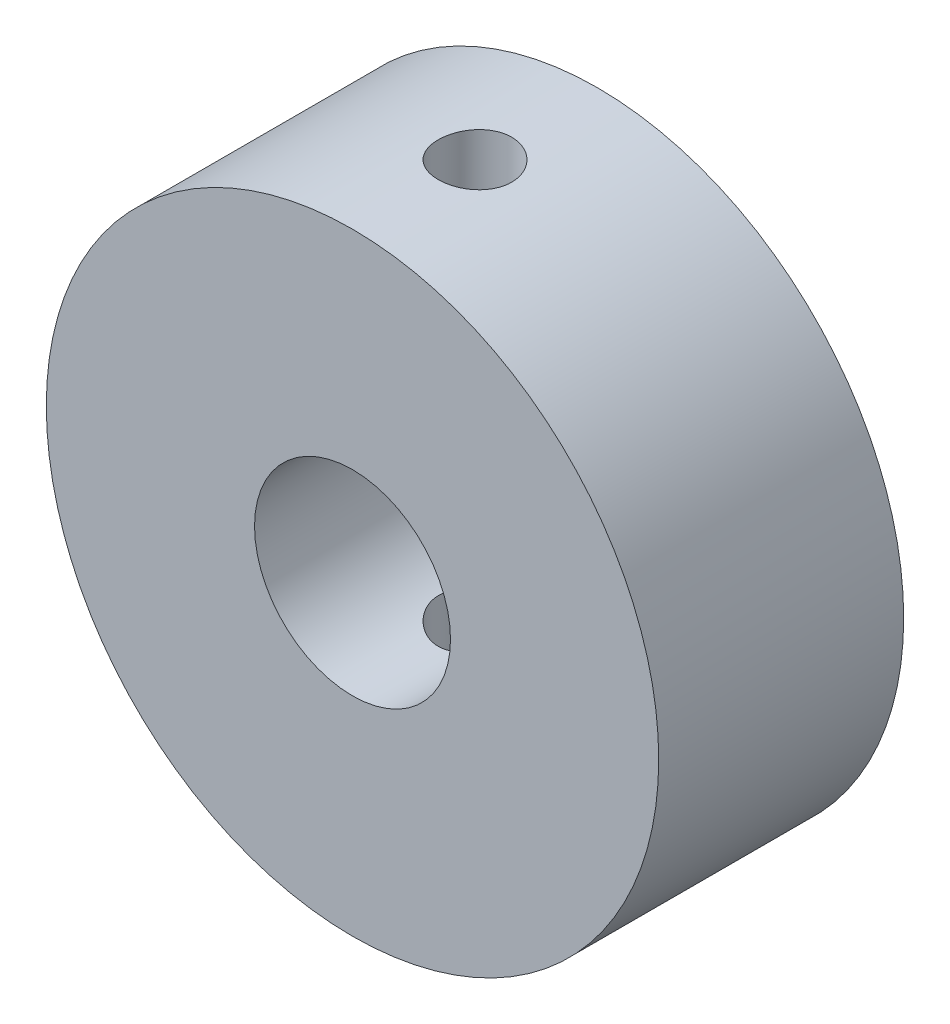
ISO-10303-21;
HEADER;
FILE_DESCRIPTION(('STEP AP214'),'2;1');
FILE_NAME('part.step','',(''),(''),'','','');
FILE_SCHEMA(('AUTOMOTIVE_DESIGN { 1 0 10303 214 1 1 1 1 }'));
ENDSEC;
DATA;
#1=APPLICATION_CONTEXT('core data for automotive mechanical design processes');
#2=APPLICATION_PROTOCOL_DEFINITION('international standard','automotive_design',2000,#1);
#3=PRODUCT_CONTEXT('',#1,'mechanical');
#4=PRODUCT('Part','Part','',(#3));
#5=PRODUCT_RELATED_PRODUCT_CATEGORY('part','',(#4));
#6=PRODUCT_DEFINITION_FORMATION('','',#4);
#7=PRODUCT_DEFINITION_CONTEXT('part definition',#1,'design');
#8=PRODUCT_DEFINITION('design','',#6,#7);
#9=PRODUCT_DEFINITION_SHAPE('','',#8);
#10=(LENGTH_UNIT() NAMED_UNIT(*) SI_UNIT(.MILLI.,.METRE.));
#11=(NAMED_UNIT(*) PLANE_ANGLE_UNIT() SI_UNIT($,.RADIAN.));
#12=(NAMED_UNIT(*) SI_UNIT($,.STERADIAN.) SOLID_ANGLE_UNIT());
#13=UNCERTAINTY_MEASURE_WITH_UNIT(LENGTH_MEASURE(1.E-05),#10,'distance_accuracy_value','');
#14=(GEOMETRIC_REPRESENTATION_CONTEXT(3) GLOBAL_UNCERTAINTY_ASSIGNED_CONTEXT((#13)) GLOBAL_UNIT_ASSIGNED_CONTEXT((#10,
#11,#12)) REPRESENTATION_CONTEXT('',''));
#15=CARTESIAN_POINT('',(0.,0.,0.));
#16=DIRECTION('',(0.,0.,1.));
#17=DIRECTION('',(1.,0.,0.));
#18=AXIS2_PLACEMENT_3D('',#15,#16,#17);
#19=CARTESIAN_POINT('',(0.,0.,5.));
#20=DIRECTION('',(0.,0.,-1.));
#21=DIRECTION('',(-1.,0.,0.));
#22=AXIS2_PLACEMENT_3D('',#19,#20,#21);
#23=CYLINDRICAL_SURFACE('',#22,12.5);
#24=CARTESIAN_POINT('',(0.,0.,5.));
#25=DIRECTION('',(0.,0.,1.));
#26=DIRECTION('',(1.,0.,0.));
#27=AXIS2_PLACEMENT_3D('',#24,#25,#26);
#28=CIRCLE('',#27,12.5);
#29=CARTESIAN_POINT('',(12.5,0.,5.));
#30=VERTEX_POINT('',#29);
#31=EDGE_CURVE('E10',#30,#30,#28,.T.);
#32=ORIENTED_EDGE('',*,*,#31,.F.);
#33=EDGE_LOOP('',(#32));
#34=FACE_BOUND('',#33,.T.);
#35=CARTESIAN_POINT('',(0.,0.,-5.));
#36=DIRECTION('',(0.,0.,1.));
#37=DIRECTION('',(1.,0.,0.));
#38=AXIS2_PLACEMENT_3D('',#35,#36,#37);
#39=CIRCLE('',#38,12.5);
#40=CARTESIAN_POINT('',(12.5,0.,-5.));
#41=VERTEX_POINT('',#40);
#42=EDGE_CURVE('E44',#41,#41,#39,.T.);
#43=ORIENTED_EDGE('',*,*,#42,.T.);
#44=EDGE_LOOP('',(#43));
#45=FACE_BOUND('',#44,.T.);
#46=CARTESIAN_POINT('',(0.,-12.5,-1.5));
#47=CARTESIAN_POINT('',(0.0839320235538497,-12.499998867873,-1.49999641802928));
#48=CARTESIAN_POINT('',(0.167917158665595,-12.4991457100204,-1.49293167065366));
#49=CARTESIAN_POINT('',(0.333552285654125,-12.495824352711,-1.46485946792231));
#50=CARTESIAN_POINT('',(0.415199714795034,-12.4933544466864,-1.44383727937471));
#51=CARTESIAN_POINT('',(0.573737397670264,-12.4870779632713,-1.38847686173699));
#52=CARTESIAN_POINT('',(0.650630743796124,-12.4832722657654,-1.35414739658791));
#53=CARTESIAN_POINT('',(0.797549578916,-12.4747479632173,-1.27316563245835));
#54=CARTESIAN_POINT('',(0.867576283567579,-12.4700295202071,-1.22651552012334));
#55=CARTESIAN_POINT('',(0.999145657672256,-12.460180052721,-1.12196256901238));
#56=CARTESIAN_POINT('',(1.0606483456536,-12.4550472515452,-1.06400957994404));
#57=CARTESIAN_POINT('',(1.17307965519171,-12.4449619698576,-0.938603517556051));
#58=CARTESIAN_POINT('',(1.22400774913237,-12.4400094983534,-0.871149970490676));
#59=CARTESIAN_POINT('',(1.31399171436948,-12.4308280185202,-0.728399587350809));
#60=CARTESIAN_POINT('',(1.35301037836285,-12.4266012951985,-0.653079137709931));
#61=CARTESIAN_POINT('',(1.4178302865078,-12.4193730672343,-0.496895648945627));
#62=CARTESIAN_POINT('',(1.44363199348388,-12.4163715196899,-0.416032804015349));
#63=CARTESIAN_POINT('',(1.481164650227,-12.4119503036869,-0.251473570344289));
#64=CARTESIAN_POINT('',(1.49296288993823,-12.4105230726271,-0.167792735786162));
#65=CARTESIAN_POINT('',(1.50236187609835,-12.4093888845306,0.000372468182082217));
#66=CARTESIAN_POINT('',(1.49996315026424,-12.4096818635516,0.0848568076084829));
#67=CARTESIAN_POINT('',(1.48109158039334,-12.4119480733153,0.251762982392175));
#68=CARTESIAN_POINT('',(1.46469271611151,-12.4139124717338,0.334193319340089));
#69=CARTESIAN_POINT('',(1.41840173085033,-12.4192864043804,0.49512351391068));
#70=CARTESIAN_POINT('',(1.38850935612907,-12.4226959657844,0.573623297589498));
#71=CARTESIAN_POINT('',(1.31599990349931,-12.4305861039738,0.724694734119557));
#72=CARTESIAN_POINT('',(1.27335053101962,-12.4350693931099,0.797250739176777));
#73=CARTESIAN_POINT('',(1.17656086584735,-12.444599699395,0.934203605457882));
#74=CARTESIAN_POINT('',(1.12242008861578,-12.4496467403106,0.998600122451287));
#75=CARTESIAN_POINT('',(1.0037737778109,-12.4597751654319,1.11783554218219));
#76=CARTESIAN_POINT('',(0.939204450256079,-12.464856563712,1.17261098492853));
#77=CARTESIAN_POINT('',(0.80175397946936,-12.4744510399275,1.27055576050015));
#78=CARTESIAN_POINT('',(0.728872819540023,-12.478964116721,1.31372507000958));
#79=CARTESIAN_POINT('',(0.576819654131423,-12.4869159430851,1.38723164281983));
#80=CARTESIAN_POINT('',(0.497645789357796,-12.4903543736405,1.41756509666522));
#81=CARTESIAN_POINT('',(0.33527801113672,-12.4957665326545,1.46448936892545));
#82=CARTESIAN_POINT('',(0.252084271220812,-12.4977403242792,1.48108078000224));
#83=CARTESIAN_POINT('',(0.0845871981871083,-12.4999926250152,1.49996812774885));
#84=CARTESIAN_POINT('',(0.000293860216025722,-12.5002815046876,1.50235151620035));
#85=CARTESIAN_POINT('',(-0.16749103412163,-12.4991593911616,1.49298571106587));
#86=CARTESIAN_POINT('',(-0.250982606163664,-12.4977484312654,1.48123679435232));
#87=CARTESIAN_POINT('',(-0.414537131964178,-12.4933916690343,1.44401251799845));
#88=CARTESIAN_POINT('',(-0.494609673184517,-12.4904505118954,1.41857869347496));
#89=CARTESIAN_POINT('',(-0.64935269884323,-12.4833627750896,1.35474964832321));
#90=CARTESIAN_POINT('',(-0.724023012961737,-12.4792161574379,1.31635401925496));
#91=CARTESIAN_POINT('',(-0.866233588832522,-12.4701542579347,1.22747854204879));
#92=CARTESIAN_POINT('',(-0.933738144813755,-12.4652354042322,1.17694193109459));
#93=CARTESIAN_POINT('',(-1.05933812576102,-12.455190895971,1.06529957679591));
#94=CARTESIAN_POINT('',(-1.11743320736475,-12.4500652338742,1.00419344792602));
#95=CARTESIAN_POINT('',(-1.22287397613077,-12.4401529742471,0.872762192286156));
#96=CARTESIAN_POINT('',(-1.2701618161597,-12.4353682915654,0.802390492328075));
#97=CARTESIAN_POINT('',(-1.35224657214666,-12.4267107496692,0.65465248746222));
#98=CARTESIAN_POINT('',(-1.38704372178037,-12.4228378733971,0.577286313440878));
#99=CARTESIAN_POINT('',(-1.44306498334079,-12.4164552867251,0.417944695552653));
#100=CARTESIAN_POINT('',(-1.46432210079673,-12.4139422637816,0.335980994070305));
#101=CARTESIAN_POINT('',(-1.49276636081758,-12.4105542637293,0.169615515257466));
#102=CARTESIAN_POINT('',(-1.49995410263041,-12.4096792168553,0.085213841921337));
#103=CARTESIAN_POINT('',(-1.50004516908965,-12.4096681633035,-0.0830563648185869));
#104=CARTESIAN_POINT('',(-1.49303936835675,-12.4105210931972,-0.166924862885633));
#105=CARTESIAN_POINT('',(-1.46513424336044,-12.4138461473713,-0.332283393197084));
#106=CARTESIAN_POINT('',(-1.44423491411034,-12.4163182722328,-0.413773424587793));
#107=CARTESIAN_POINT('',(-1.38916369910273,-12.4225998262293,-0.572052269444348));
#108=CARTESIAN_POINT('',(-1.35499582785269,-12.4264088508406,-0.648842496747742));
#109=CARTESIAN_POINT('',(-1.27436641314005,-12.4349357269569,-0.79561387353505));
#110=CARTESIAN_POINT('',(-1.22790476354723,-12.4396535863076,-0.865594964229653));
#111=CARTESIAN_POINT('',(-1.12366844823603,-12.4495027561294,-0.997226470054419));
#112=CARTESIAN_POINT('',(-1.06582601965075,-12.4546364290673,-1.05882305163314));
#113=CARTESIAN_POINT('',(-0.940610466672237,-12.4647177484085,-1.171471239783));
#114=CARTESIAN_POINT('',(-0.873235091318004,-12.4696653505255,-1.2225203488146));
#115=CARTESIAN_POINT('',(-0.730596612325683,-12.4788360854662,-1.31277528899943));
#116=CARTESIAN_POINT('',(-0.655306617312087,-12.4830566108105,-1.35193886286114));
#117=CARTESIAN_POINT('',(-0.499211375842655,-12.4902709259863,-1.41701188222129));
#118=CARTESIAN_POINT('',(-0.418412282181072,-12.4932660590307,-1.44293584809019));
#119=CARTESIAN_POINT('',(-0.280988550618348,-12.4969634163,-1.47453171016906));
#120=CARTESIAN_POINT('',(-0.225233284876744,-12.4980966397165,-1.48406874194319));
#121=CARTESIAN_POINT('',(-0.112993367846847,-12.4996153102102,-1.49680407174548));
#122=CARTESIAN_POINT('',(-0.0565087213768126,-12.5000007622246,-1.50000241162523));
#123=CARTESIAN_POINT('',(0.,-12.5,-1.5));
#124=B_SPLINE_CURVE_WITH_KNOTS('',3,(#46,#47,#48,#49,#50,#51,#52,#53,#54,#55,#56,#57,#58,#59,
#60,#61,#62,#63,#64,#65,#66,#67,#68,#69,#70,#71,#72,#73,#74,#75,#76,#77,#78,#79,#80,#81,#82,#83,
#84,#85,#86,#87,#88,#89,#90,#91,#92,#93,#94,#95,#96,#97,#98,#99,#100,#101,#102,#103,#104,#105,
#106,#107,#108,#109,#110,#111,#112,#113,#114,#115,#116,#117,#118,#119,#120,#121,#122,#123),
.UNSPECIFIED.,.T.,.F.,(4,2,2,2,2,2,2,2,2,2,2,2,2,2,2,2,2,2,2,2,2,2,2,2,2,2,2,2,2,2,2,2,2,2,2,2,
2,2,4),(0.,0.25158967547808,0.503445347043117,0.7551354318778,1.00678087720846,1.25956936097939,
1.51237045452442,1.76595344748199,2.01952755999557,2.27187819171639,2.5242194433424,
2.77523546456126,3.02625620626698,3.27791786855268,3.52959014434631,3.78286472320158,
4.036139810863,4.28949001347139,4.54282928911309,4.79460761312113,5.04638100450539,
5.29739451278874,5.54841593150834,5.80063460892782,6.05286248801782,6.30641037908359,
6.55995352653149,6.81287624132444,7.06578818330771,7.31708596596146,7.56838383881169,
7.81960573856942,8.07082980715607,8.3235976201016,8.57642521760045,8.83014145119729,
9.08357882396374,9.25296714728134,9.42235435219904),.UNSPECIFIED.);
#125=CARTESIAN_POINT('',(0.,-12.5,-1.5));
#126=VERTEX_POINT('',#125);
#127=EDGE_CURVE('E72',#126,#126,#124,.T.);
#128=ORIENTED_EDGE('',*,*,#127,.F.);
#129=EDGE_LOOP('',(#128));
#130=FACE_BOUND('',#129,.T.);
#131=CARTESIAN_POINT('',(0.,12.5,-1.5));
#132=CARTESIAN_POINT('',(-0.0839320235538497,12.499998867873,-1.49999641802928));
#133=CARTESIAN_POINT('',(-0.167917158665595,12.4991457100204,-1.49293167065366));
#134=CARTESIAN_POINT('',(-0.333552285654125,12.495824352711,-1.46485946792231));
#135=CARTESIAN_POINT('',(-0.415199714795034,12.4933544466864,-1.44383727937471));
#136=CARTESIAN_POINT('',(-0.573737397670264,12.4870779632713,-1.38847686173699));
#137=CARTESIAN_POINT('',(-0.650630743796124,12.4832722657654,-1.35414739658791));
#138=CARTESIAN_POINT('',(-0.797549578916,12.4747479632173,-1.27316563245835));
#139=CARTESIAN_POINT('',(-0.867576283567579,12.4700295202071,-1.22651552012334));
#140=CARTESIAN_POINT('',(-0.999145657672256,12.460180052721,-1.12196256901238));
#141=CARTESIAN_POINT('',(-1.0606483456536,12.4550472515452,-1.06400957994404));
#142=CARTESIAN_POINT('',(-1.17307965519171,12.4449619698576,-0.938603517556051));
#143=CARTESIAN_POINT('',(-1.22400774913237,12.4400094983534,-0.871149970490676));
#144=CARTESIAN_POINT('',(-1.31399171436948,12.4308280185202,-0.728399587350809));
#145=CARTESIAN_POINT('',(-1.35301037836285,12.4266012951985,-0.653079137709931));
#146=CARTESIAN_POINT('',(-1.4178302865078,12.4193730672343,-0.496895648945627));
#147=CARTESIAN_POINT('',(-1.44363199348388,12.4163715196899,-0.416032804015349));
#148=CARTESIAN_POINT('',(-1.481164650227,12.4119503036869,-0.251473570344289));
#149=CARTESIAN_POINT('',(-1.49296288993823,12.4105230726271,-0.167792735786162));
#150=CARTESIAN_POINT('',(-1.50236187609835,12.4093888845306,0.000372468182082217));
#151=CARTESIAN_POINT('',(-1.49996315026424,12.4096818635516,0.0848568076084829));
#152=CARTESIAN_POINT('',(-1.48109158039334,12.4119480733153,0.251762982392175));
#153=CARTESIAN_POINT('',(-1.46469271611151,12.4139124717338,0.334193319340089));
#154=CARTESIAN_POINT('',(-1.41840173085033,12.4192864043804,0.49512351391068));
#155=CARTESIAN_POINT('',(-1.38850935612907,12.4226959657844,0.573623297589498));
#156=CARTESIAN_POINT('',(-1.31599990349931,12.4305861039738,0.724694734119557));
#157=CARTESIAN_POINT('',(-1.27335053101962,12.4350693931099,0.797250739176777));
#158=CARTESIAN_POINT('',(-1.17656086584735,12.444599699395,0.934203605457882));
#159=CARTESIAN_POINT('',(-1.12242008861578,12.4496467403106,0.998600122451287));
#160=CARTESIAN_POINT('',(-1.0037737778109,12.4597751654319,1.11783554218219));
#161=CARTESIAN_POINT('',(-0.939204450256079,12.464856563712,1.17261098492853));
#162=CARTESIAN_POINT('',(-0.80175397946936,12.4744510399275,1.27055576050015));
#163=CARTESIAN_POINT('',(-0.728872819540023,12.478964116721,1.31372507000958));
#164=CARTESIAN_POINT('',(-0.576819654131423,12.4869159430851,1.38723164281983));
#165=CARTESIAN_POINT('',(-0.497645789357796,12.4903543736405,1.41756509666522));
#166=CARTESIAN_POINT('',(-0.33527801113672,12.4957665326545,1.46448936892545));
#167=CARTESIAN_POINT('',(-0.252084271220812,12.4977403242792,1.48108078000224));
#168=CARTESIAN_POINT('',(-0.0845871981871083,12.4999926250152,1.49996812774885));
#169=CARTESIAN_POINT('',(-0.000293860216025722,12.5002815046876,1.50235151620035));
#170=CARTESIAN_POINT('',(0.16749103412163,12.4991593911616,1.49298571106587));
#171=CARTESIAN_POINT('',(0.250982606163664,12.4977484312654,1.48123679435232));
#172=CARTESIAN_POINT('',(0.414537131964178,12.4933916690343,1.44401251799845));
#173=CARTESIAN_POINT('',(0.494609673184517,12.4904505118954,1.41857869347496));
#174=CARTESIAN_POINT('',(0.64935269884323,12.4833627750896,1.35474964832321));
#175=CARTESIAN_POINT('',(0.724023012961737,12.4792161574379,1.31635401925496));
#176=CARTESIAN_POINT('',(0.866233588832522,12.4701542579347,1.22747854204879));
#177=CARTESIAN_POINT('',(0.933738144813755,12.4652354042322,1.17694193109459));
#178=CARTESIAN_POINT('',(1.05933812576102,12.455190895971,1.06529957679591));
#179=CARTESIAN_POINT('',(1.11743320736475,12.4500652338742,1.00419344792602));
#180=CARTESIAN_POINT('',(1.22287397613077,12.4401529742471,0.872762192286156));
#181=CARTESIAN_POINT('',(1.2701618161597,12.4353682915654,0.802390492328075));
#182=CARTESIAN_POINT('',(1.35224657214666,12.4267107496692,0.65465248746222));
#183=CARTESIAN_POINT('',(1.38704372178037,12.4228378733971,0.577286313440878));
#184=CARTESIAN_POINT('',(1.44306498334079,12.4164552867251,0.417944695552653));
#185=CARTESIAN_POINT('',(1.46432210079673,12.4139422637816,0.335980994070305));
#186=CARTESIAN_POINT('',(1.49276636081758,12.4105542637293,0.169615515257466));
#187=CARTESIAN_POINT('',(1.49995410263041,12.4096792168553,0.085213841921337));
#188=CARTESIAN_POINT('',(1.50004516908965,12.4096681633035,-0.0830563648185869));
#189=CARTESIAN_POINT('',(1.49303936835675,12.4105210931972,-0.166924862885633));
#190=CARTESIAN_POINT('',(1.46513424336044,12.4138461473713,-0.332283393197084));
#191=CARTESIAN_POINT('',(1.44423491411034,12.4163182722328,-0.413773424587793));
#192=CARTESIAN_POINT('',(1.38916369910273,12.4225998262293,-0.572052269444348));
#193=CARTESIAN_POINT('',(1.35499582785269,12.4264088508406,-0.648842496747742));
#194=CARTESIAN_POINT('',(1.27436641314005,12.4349357269569,-0.79561387353505));
#195=CARTESIAN_POINT('',(1.22790476354723,12.4396535863076,-0.865594964229653));
#196=CARTESIAN_POINT('',(1.12366844823603,12.4495027561294,-0.997226470054419));
#197=CARTESIAN_POINT('',(1.06582601965075,12.4546364290673,-1.05882305163314));
#198=CARTESIAN_POINT('',(0.940610466672237,12.4647177484085,-1.171471239783));
#199=CARTESIAN_POINT('',(0.873235091318004,12.4696653505255,-1.2225203488146));
#200=CARTESIAN_POINT('',(0.730596612325683,12.4788360854662,-1.31277528899943));
#201=CARTESIAN_POINT('',(0.655306617312087,12.4830566108105,-1.35193886286114));
#202=CARTESIAN_POINT('',(0.499211375842655,12.4902709259863,-1.41701188222129));
#203=CARTESIAN_POINT('',(0.418412282181072,12.4932660590307,-1.44293584809019));
#204=CARTESIAN_POINT('',(0.280988550618348,12.4969634163,-1.47453171016906));
#205=CARTESIAN_POINT('',(0.225233284876744,12.4980966397165,-1.48406874194319));
#206=CARTESIAN_POINT('',(0.112993367846847,12.4996153102102,-1.49680407174548));
#207=CARTESIAN_POINT('',(0.0565087213768126,12.5000007622246,-1.50000241162523));
#208=CARTESIAN_POINT('',(0.,12.5,-1.5));
#209=B_SPLINE_CURVE_WITH_KNOTS('',3,(#131,#132,#133,#134,#135,#136,#137,#138,#139,#140,#141,
#142,#143,#144,#145,#146,#147,#148,#149,#150,#151,#152,#153,#154,#155,#156,#157,#158,#159,#160,
#161,#162,#163,#164,#165,#166,#167,#168,#169,#170,#171,#172,#173,#174,#175,#176,#177,#178,#179,
#180,#181,#182,#183,#184,#185,#186,#187,#188,#189,#190,#191,#192,#193,#194,#195,#196,#197,#198,
#199,#200,#201,#202,#203,#204,#205,#206,#207,#208),.UNSPECIFIED.,.T.,.F.,(4,2,2,2,2,2,2,2,2,2,2,
2,2,2,2,2,2,2,2,2,2,2,2,2,2,2,2,2,2,2,2,2,2,2,2,2,2,2,4),(0.,0.25158967547808,0.503445347043117,
0.7551354318778,1.00678087720846,1.25956936097939,1.51237045452442,1.76595344748199,
2.01952755999557,2.27187819171639,2.5242194433424,2.77523546456126,3.02625620626698,
3.27791786855268,3.52959014434631,3.78286472320158,4.036139810863,4.28949001347139,
4.54282928911309,4.79460761312113,5.04638100450539,5.29739451278874,5.54841593150834,
5.80063460892782,6.05286248801782,6.30641037908359,6.55995352653149,6.81287624132444,
7.06578818330771,7.31708596596146,7.56838383881169,7.81960573856942,8.07082980715607,
8.3235976201016,8.57642521760045,8.83014145119729,9.08357882396374,9.25296714728134,
9.42235435219904),.UNSPECIFIED.);
#210=CARTESIAN_POINT('',(0.,12.5,-1.5));
#211=VERTEX_POINT('',#210);
#212=EDGE_CURVE('E77',#211,#211,#209,.T.);
#213=ORIENTED_EDGE('',*,*,#212,.F.);
#214=EDGE_LOOP('',(#213));
#215=FACE_BOUND('',#214,.T.);
#216=ADVANCED_FACE('F31',(#34,#45,#130,#215),#23,.T.);
#217=CARTESIAN_POINT('',(0.,0.,5.));
#218=DIRECTION('',(0.,0.,-1.));
#219=DIRECTION('',(-1.,0.,0.));
#220=AXIS2_PLACEMENT_3D('',#217,#218,#219);
#221=CYLINDRICAL_SURFACE('',#220,4.);
#222=CARTESIAN_POINT('',(0.,-4.,-1.5));
#223=CARTESIAN_POINT('',(0.0812350589378529,-4.00000217456151,-1.50000290230311));
#224=CARTESIAN_POINT('',(0.162450241781792,-3.99750379283184,-1.49338023975162));
#225=CARTESIAN_POINT('',(0.322453452352361,-3.98778696006928,-1.46717180473007));
#226=CARTESIAN_POINT('',(0.401241827987616,-3.98056918893993,-1.44758789952943));
#227=CARTESIAN_POINT('',(0.554060784990879,-3.96218832391545,-1.39624699822824));
#228=CARTESIAN_POINT('',(0.628100224162278,-3.9510328434944,-1.36451348317821));
#229=CARTESIAN_POINT('',(0.769799310160254,-3.92588767765353,-1.28989358698418));
#230=CARTESIAN_POINT('',(0.837457239177879,-3.91189723227548,-1.24700421445584));
#231=CARTESIAN_POINT('',(0.967346417045826,-3.88186246971217,-1.14938746892909));
#232=CARTESIAN_POINT('',(1.02927073015119,-3.86576002583566,-1.0942697377406));
#233=CARTESIAN_POINT('',(1.14324421474363,-3.83360220871327,-0.974589565341157));
#234=CARTESIAN_POINT('',(1.19529036359203,-3.81754685135033,-0.910024243912125));
#235=CARTESIAN_POINT('',(1.28998202215985,-3.78662470617731,-0.770282532476789));
#236=CARTESIAN_POINT('',(1.3321939319576,-3.77182648820818,-0.694795633454181));
#237=CARTESIAN_POINT('',(1.40318646334084,-3.74599860237433,-0.537151645831477));
#238=CARTESIAN_POINT('',(1.43197244961239,-3.73496742975881,-0.454997236844897));
#239=CARTESIAN_POINT('',(1.47408431017549,-3.71854412824136,-0.289883259741799));
#240=CARTESIAN_POINT('',(1.48799593218558,-3.71293924350838,-0.207094961564558));
#241=CARTESIAN_POINT('',(1.50179556531648,-3.70738061461215,-0.040183842006158));
#242=CARTESIAN_POINT('',(1.5016893680263,-3.70742453659305,0.0439384138744703));
#243=CARTESIAN_POINT('',(1.48790429610018,-3.71297511632055,0.205769525212958));
#244=CARTESIAN_POINT('',(1.47503808509003,-3.71815468871122,0.283560906044178));
#245=CARTESIAN_POINT('',(1.4374416786833,-3.73284938059529,0.435787150405318));
#246=CARTESIAN_POINT('',(1.41270969663258,-3.74236515298863,0.510221506613881));
#247=CARTESIAN_POINT('',(1.35163748571904,-3.76485702190253,0.655277067728233));
#248=CARTESIAN_POINT('',(1.31508648737101,-3.77789517988166,0.725799486121303));
#249=CARTESIAN_POINT('',(1.23156073762698,-3.80594210139319,0.859945737590972));
#250=CARTESIAN_POINT('',(1.18458238728897,-3.82095154457158,0.9235671775197));
#251=CARTESIAN_POINT('',(1.07781780766549,-3.85248038859113,1.04660366365088));
#252=CARTESIAN_POINT('',(1.01738298716955,-3.86903347455671,1.10544864074809));
#253=CARTESIAN_POINT('',(0.88731259081902,-3.90091728164085,1.2123379662058));
#254=CARTESIAN_POINT('',(0.817675603497364,-3.91624781465952,1.26038065460567));
#255=CARTESIAN_POINT('',(0.669723436992419,-3.9442639480908,1.34493039706252));
#256=CARTESIAN_POINT('',(0.591290713844719,-3.95690498259616,1.38124758122106));
#257=CARTESIAN_POINT('',(0.428836850524583,-3.97778718326962,1.43998260427004));
#258=CARTESIAN_POINT('',(0.344818210845767,-3.98603030341493,1.46240661656112));
#259=CARTESIAN_POINT('',(0.178375243148665,-3.99684443228065,1.49162278754194));
#260=CARTESIAN_POINT('',(0.096103619562209,-3.99969369025686,1.49918260638251));
#261=CARTESIAN_POINT('',(-0.0685724752550246,-4.00025893700126,1.50069106389992));
#262=CARTESIAN_POINT('',(-0.150976912983373,-3.99797606386863,1.49464272031678));
#263=CARTESIAN_POINT('',(-0.31026204856186,-3.98871709772643,1.46968995769133));
#264=CARTESIAN_POINT('',(-0.387233328007336,-3.98192470962305,1.45128845626291));
#265=CARTESIAN_POINT('',(-0.536941754957221,-3.96451477091717,1.40281392745268));
#266=CARTESIAN_POINT('',(-0.609678350347535,-3.9538967228203,1.37273938205196));
#267=CARTESIAN_POINT('',(-0.751247765110156,-3.92949624407681,1.30081358756052));
#268=CARTESIAN_POINT('',(-0.819903083557796,-3.91563000209348,1.25864227077661));
#269=CARTESIAN_POINT('',(-0.949392711726626,-3.88626671564664,1.16408189682844));
#270=CARTESIAN_POINT('',(-1.01022412027045,-3.87076907009516,1.11168906745485));
#271=CARTESIAN_POINT('',(-1.12603079874454,-3.8387332949099,0.994595877875725));
#272=CARTESIAN_POINT('',(-1.18046154123569,-3.82218696503729,0.929357817227301));
#273=CARTESIAN_POINT('',(-1.27771050031903,-3.79078815746854,0.790348615292344));
#274=CARTESIAN_POINT('',(-1.32052767414518,-3.77593583194399,0.7165767086115));
#275=CARTESIAN_POINT('',(-1.39337773518998,-3.74966829822463,0.561984013227687));
#276=CARTESIAN_POINT('',(-1.42335685446918,-3.73826760328493,0.481135254089564));
#277=CARTESIAN_POINT('',(-1.46907883466889,-3.72054032891005,0.314990236312177));
#278=CARTESIAN_POINT('',(-1.48483050305535,-3.71421061057491,0.229696763801877));
#279=CARTESIAN_POINT('',(-1.50086347097839,-3.70775894792573,0.0629838404588854));
#280=CARTESIAN_POINT('',(-1.50207331495837,-3.70726444523341,-0.0183326317168858));
#281=CARTESIAN_POINT('',(-1.49136715641593,-3.71158412745292,-0.179945316276165));
#282=CARTESIAN_POINT('',(-1.47945239850124,-3.71639780898899,-0.260241624671584));
#283=CARTESIAN_POINT('',(-1.44355815630242,-3.73048141585432,-0.415047226716552));
#284=CARTESIAN_POINT('',(-1.41995798316524,-3.73961085376663,-0.489658346245346));
#285=CARTESIAN_POINT('',(-1.3616969677992,-3.76121548297845,-0.633905508494421));
#286=CARTESIAN_POINT('',(-1.32703332944945,-3.77369151995215,-0.703540288070143));
#287=CARTESIAN_POINT('',(-1.24552075938154,-3.80139723903965,-0.839826789697632));
#288=CARTESIAN_POINT('',(-1.1981283280301,-3.81673698440964,-0.906130796799912));
#289=CARTESIAN_POINT('',(-1.09334485729906,-3.84806246757177,-1.0301415609712));
#290=CARTESIAN_POINT('',(-1.03595064012808,-3.86404840943145,-1.08784557478675));
#291=CARTESIAN_POINT('',(-0.909080396784622,-3.89590424609881,-1.19620195582184));
#292=CARTESIAN_POINT('',(-0.839118644212991,-3.91172104900645,-1.24630375343467));
#293=CARTESIAN_POINT('',(-0.691213223200819,-3.94054514457031,-1.33402265527656));
#294=CARTESIAN_POINT('',(-0.61326893409062,-3.95355221851559,-1.37163878773637));
#295=CARTESIAN_POINT('',(-0.447999082002311,-3.9757429260668,-1.43437682904833));
#296=CARTESIAN_POINT('',(-0.360413422234208,-3.98473657158356,-1.4588870646019));
#297=CARTESIAN_POINT('',(-0.181875733606382,-3.99686242179587,-1.49169295992068));
#298=CARTESIAN_POINT('',(-0.0909254163648591,-3.99999756603967,-1.49999675148732));
#299=CARTESIAN_POINT('',(0.,-4.,-1.5));
#300=B_SPLINE_CURVE_WITH_KNOTS('',3,(#222,#223,#224,#225,#226,#227,#228,#229,#230,#231,#232,
#233,#234,#235,#236,#237,#238,#239,#240,#241,#242,#243,#244,#245,#246,#247,#248,#249,#250,#251,
#252,#253,#254,#255,#256,#257,#258,#259,#260,#261,#262,#263,#264,#265,#266,#267,#268,#269,#270,
#271,#272,#273,#274,#275,#276,#277,#278,#279,#280,#281,#282,#283,#284,#285,#286,#287,#288,#289,
#290,#291,#292,#293,#294,#295,#296,#297,#298,#299),.UNSPECIFIED.,.T.,.F.,(4,2,2,2,2,2,2,2,2,2,2,
2,2,2,2,2,2,2,2,2,2,2,2,2,2,2,2,2,2,2,2,2,2,2,2,2,2,2,4),(0.,0.24336980156056,0.48670454953046,
0.729571369213573,0.97250337960949,1.22473618582715,1.47704604925622,1.73896674501659,
2.00078269352134,2.25185874416901,2.50283106079707,2.73878345119971,2.97477138060589,
3.21522408387018,3.45575990744259,3.71246153335813,3.96920257905066,4.22991375286075,
4.49050899698846,4.73725019635925,4.98393668390521,5.2211443792384,5.45838293254454,
5.702592218596,5.94689180019868,6.20536519455658,6.46386178920141,6.72343066727204,
6.98283874956507,7.22558763480252,7.46831350211259,7.70363142426533,7.93900886656506,
8.18672471884271,8.43451941997062,8.69572329654039,8.95694749805102,9.22948515032042,
9.50188601796127),.UNSPECIFIED.);
#301=CARTESIAN_POINT('',(0.,-4.,-1.5));
#302=VERTEX_POINT('',#301);
#303=EDGE_CURVE('E54',#302,#302,#300,.T.);
#304=ORIENTED_EDGE('',*,*,#303,.T.);
#305=EDGE_LOOP('',(#304));
#306=FACE_BOUND('',#305,.T.);
#307=CARTESIAN_POINT('',(0.,0.,5.));
#308=DIRECTION('',(0.,0.,1.));
#309=DIRECTION('',(1.,0.,0.));
#310=AXIS2_PLACEMENT_3D('',#307,#308,#309);
#311=CIRCLE('',#310,4.);
#312=CARTESIAN_POINT('',(4.,0.,5.));
#313=VERTEX_POINT('',#312);
#314=EDGE_CURVE('E49',#313,#313,#311,.T.);
#315=ORIENTED_EDGE('',*,*,#314,.T.);
#316=EDGE_LOOP('',(#315));
#317=FACE_BOUND('',#316,.T.);
#318=CARTESIAN_POINT('',(0.,0.,-5.));
#319=DIRECTION('',(0.,0.,1.));
#320=DIRECTION('',(1.,0.,0.));
#321=AXIS2_PLACEMENT_3D('',#318,#319,#320);
#322=CIRCLE('',#321,4.);
#323=CARTESIAN_POINT('',(4.,0.,-5.));
#324=VERTEX_POINT('',#323);
#325=EDGE_CURVE('E52',#324,#324,#322,.T.);
#326=ORIENTED_EDGE('',*,*,#325,.F.);
#327=EDGE_LOOP('',(#326));
#328=FACE_BOUND('',#327,.T.);
#329=CARTESIAN_POINT('',(0.,4.,-1.5));
#330=CARTESIAN_POINT('',(-0.0812350589378529,4.00000217456151,-1.50000290230311));
#331=CARTESIAN_POINT('',(-0.162450241781792,3.99750379283184,-1.49338023975162));
#332=CARTESIAN_POINT('',(-0.322453452352361,3.98778696006928,-1.46717180473007));
#333=CARTESIAN_POINT('',(-0.401241827987616,3.98056918893993,-1.44758789952943));
#334=CARTESIAN_POINT('',(-0.554060784990879,3.96218832391545,-1.39624699822824));
#335=CARTESIAN_POINT('',(-0.628100224162278,3.9510328434944,-1.36451348317821));
#336=CARTESIAN_POINT('',(-0.769799310160254,3.92588767765353,-1.28989358698418));
#337=CARTESIAN_POINT('',(-0.837457239177879,3.91189723227548,-1.24700421445584));
#338=CARTESIAN_POINT('',(-0.967346417045826,3.88186246971217,-1.14938746892909));
#339=CARTESIAN_POINT('',(-1.02927073015119,3.86576002583566,-1.0942697377406));
#340=CARTESIAN_POINT('',(-1.14324421474363,3.83360220871327,-0.974589565341157));
#341=CARTESIAN_POINT('',(-1.19529036359203,3.81754685135033,-0.910024243912125));
#342=CARTESIAN_POINT('',(-1.28998202215985,3.78662470617731,-0.770282532476789));
#343=CARTESIAN_POINT('',(-1.3321939319576,3.77182648820818,-0.694795633454181));
#344=CARTESIAN_POINT('',(-1.40318646334084,3.74599860237433,-0.537151645831477));
#345=CARTESIAN_POINT('',(-1.43197244961239,3.73496742975881,-0.454997236844897));
#346=CARTESIAN_POINT('',(-1.47408431017549,3.71854412824136,-0.289883259741799));
#347=CARTESIAN_POINT('',(-1.48799593218558,3.71293924350838,-0.207094961564558));
#348=CARTESIAN_POINT('',(-1.50179556531648,3.70738061461215,-0.040183842006158));
#349=CARTESIAN_POINT('',(-1.5016893680263,3.70742453659305,0.0439384138744703));
#350=CARTESIAN_POINT('',(-1.48790429610018,3.71297511632055,0.205769525212958));
#351=CARTESIAN_POINT('',(-1.47503808509003,3.71815468871122,0.283560906044178));
#352=CARTESIAN_POINT('',(-1.4374416786833,3.73284938059529,0.435787150405318));
#353=CARTESIAN_POINT('',(-1.41270969663258,3.74236515298863,0.510221506613881));
#354=CARTESIAN_POINT('',(-1.35163748571904,3.76485702190253,0.655277067728233));
#355=CARTESIAN_POINT('',(-1.31508648737101,3.77789517988166,0.725799486121303));
#356=CARTESIAN_POINT('',(-1.23156073762698,3.80594210139319,0.859945737590972));
#357=CARTESIAN_POINT('',(-1.18458238728897,3.82095154457158,0.9235671775197));
#358=CARTESIAN_POINT('',(-1.07781780766549,3.85248038859113,1.04660366365088));
#359=CARTESIAN_POINT('',(-1.01738298716955,3.86903347455671,1.10544864074809));
#360=CARTESIAN_POINT('',(-0.88731259081902,3.90091728164085,1.2123379662058));
#361=CARTESIAN_POINT('',(-0.817675603497364,3.91624781465952,1.26038065460567));
#362=CARTESIAN_POINT('',(-0.669723436992419,3.9442639480908,1.34493039706252));
#363=CARTESIAN_POINT('',(-0.591290713844719,3.95690498259616,1.38124758122106));
#364=CARTESIAN_POINT('',(-0.428836850524583,3.97778718326962,1.43998260427004));
#365=CARTESIAN_POINT('',(-0.344818210845767,3.98603030341493,1.46240661656112));
#366=CARTESIAN_POINT('',(-0.178375243148665,3.99684443228065,1.49162278754194));
#367=CARTESIAN_POINT('',(-0.096103619562209,3.99969369025686,1.49918260638251));
#368=CARTESIAN_POINT('',(0.0685724752550246,4.00025893700126,1.50069106389992));
#369=CARTESIAN_POINT('',(0.150976912983373,3.99797606386863,1.49464272031678));
#370=CARTESIAN_POINT('',(0.31026204856186,3.98871709772643,1.46968995769133));
#371=CARTESIAN_POINT('',(0.387233328007336,3.98192470962305,1.45128845626291));
#372=CARTESIAN_POINT('',(0.536941754957221,3.96451477091717,1.40281392745268));
#373=CARTESIAN_POINT('',(0.609678350347535,3.9538967228203,1.37273938205196));
#374=CARTESIAN_POINT('',(0.751247765110156,3.92949624407681,1.30081358756052));
#375=CARTESIAN_POINT('',(0.819903083557796,3.91563000209348,1.25864227077661));
#376=CARTESIAN_POINT('',(0.949392711726626,3.88626671564664,1.16408189682844));
#377=CARTESIAN_POINT('',(1.01022412027045,3.87076907009516,1.11168906745485));
#378=CARTESIAN_POINT('',(1.12603079874454,3.8387332949099,0.994595877875725));
#379=CARTESIAN_POINT('',(1.18046154123569,3.82218696503729,0.929357817227301));
#380=CARTESIAN_POINT('',(1.27771050031903,3.79078815746854,0.790348615292344));
#381=CARTESIAN_POINT('',(1.32052767414518,3.77593583194399,0.7165767086115));
#382=CARTESIAN_POINT('',(1.39337773518998,3.74966829822463,0.561984013227687));
#383=CARTESIAN_POINT('',(1.42335685446918,3.73826760328493,0.481135254089564));
#384=CARTESIAN_POINT('',(1.46907883466889,3.72054032891005,0.314990236312177));
#385=CARTESIAN_POINT('',(1.48483050305535,3.71421061057491,0.229696763801877));
#386=CARTESIAN_POINT('',(1.50086347097839,3.70775894792573,0.0629838404588854));
#387=CARTESIAN_POINT('',(1.50207331495837,3.70726444523341,-0.0183326317168858));
#388=CARTESIAN_POINT('',(1.49136715641593,3.71158412745292,-0.179945316276165));
#389=CARTESIAN_POINT('',(1.47945239850124,3.71639780898899,-0.260241624671584));
#390=CARTESIAN_POINT('',(1.44355815630242,3.73048141585432,-0.415047226716552));
#391=CARTESIAN_POINT('',(1.41995798316524,3.73961085376663,-0.489658346245346));
#392=CARTESIAN_POINT('',(1.3616969677992,3.76121548297845,-0.633905508494421));
#393=CARTESIAN_POINT('',(1.32703332944945,3.77369151995215,-0.703540288070143));
#394=CARTESIAN_POINT('',(1.24552075938154,3.80139723903965,-0.839826789697632));
#395=CARTESIAN_POINT('',(1.1981283280301,3.81673698440964,-0.906130796799912));
#396=CARTESIAN_POINT('',(1.09334485729906,3.84806246757177,-1.0301415609712));
#397=CARTESIAN_POINT('',(1.03595064012808,3.86404840943145,-1.08784557478675));
#398=CARTESIAN_POINT('',(0.909080396784622,3.89590424609881,-1.19620195582184));
#399=CARTESIAN_POINT('',(0.839118644212991,3.91172104900645,-1.24630375343467));
#400=CARTESIAN_POINT('',(0.691213223200819,3.94054514457031,-1.33402265527656));
#401=CARTESIAN_POINT('',(0.61326893409062,3.95355221851559,-1.37163878773637));
#402=CARTESIAN_POINT('',(0.447999082002311,3.9757429260668,-1.43437682904833));
#403=CARTESIAN_POINT('',(0.360413422234208,3.98473657158356,-1.4588870646019));
#404=CARTESIAN_POINT('',(0.181875733606382,3.99686242179587,-1.49169295992068));
#405=CARTESIAN_POINT('',(0.0909254163648591,3.99999756603967,-1.49999675148732));
#406=CARTESIAN_POINT('',(0.,4.,-1.5));
#407=B_SPLINE_CURVE_WITH_KNOTS('',3,(#329,#330,#331,#332,#333,#334,#335,#336,#337,#338,#339,
#340,#341,#342,#343,#344,#345,#346,#347,#348,#349,#350,#351,#352,#353,#354,#355,#356,#357,#358,
#359,#360,#361,#362,#363,#364,#365,#366,#367,#368,#369,#370,#371,#372,#373,#374,#375,#376,#377,
#378,#379,#380,#381,#382,#383,#384,#385,#386,#387,#388,#389,#390,#391,#392,#393,#394,#395,#396,
#397,#398,#399,#400,#401,#402,#403,#404,#405,#406),.UNSPECIFIED.,.T.,.F.,(4,2,2,2,2,2,2,2,2,2,2,
2,2,2,2,2,2,2,2,2,2,2,2,2,2,2,2,2,2,2,2,2,2,2,2,2,2,2,4),(0.,0.24336980156056,0.48670454953046,
0.729571369213573,0.97250337960949,1.22473618582715,1.47704604925622,1.73896674501659,
2.00078269352134,2.25185874416901,2.50283106079707,2.73878345119971,2.97477138060589,
3.21522408387018,3.45575990744259,3.71246153335813,3.96920257905066,4.22991375286075,
4.49050899698846,4.73725019635925,4.98393668390521,5.2211443792384,5.45838293254454,
5.702592218596,5.94689180019868,6.20536519455658,6.46386178920141,6.72343066727204,
6.98283874956507,7.22558763480252,7.46831350211259,7.70363142426533,7.93900886656506,
8.18672471884271,8.43451941997062,8.69572329654039,8.95694749805102,9.22948515032042,
9.50188601796127),.UNSPECIFIED.);
#408=CARTESIAN_POINT('',(0.,4.,-1.5));
#409=VERTEX_POINT('',#408);
#410=EDGE_CURVE('E35',#409,#409,#407,.T.);
#411=ORIENTED_EDGE('',*,*,#410,.T.);
#412=EDGE_LOOP('',(#411));
#413=FACE_BOUND('',#412,.T.);
#414=ADVANCED_FACE('F59',(#306,#317,#328,#413),#221,.F.);
#415=CARTESIAN_POINT('',(0.,0.,5.));
#416=DIRECTION('',(0.,0.,1.));
#417=DIRECTION('',(1.,0.,0.));
#418=AXIS2_PLACEMENT_3D('',#415,#416,#417);
#419=PLANE('',#418);
#420=ORIENTED_EDGE('',*,*,#31,.T.);
#421=EDGE_LOOP('',(#420));
#422=FACE_BOUND('',#421,.T.);
#423=ORIENTED_EDGE('',*,*,#314,.F.);
#424=EDGE_LOOP('',(#423));
#425=FACE_BOUND('',#424,.T.);
#426=ADVANCED_FACE('F92',(#422,#425),#419,.T.);
#427=CARTESIAN_POINT('',(0.,0.,-5.));
#428=DIRECTION('',(0.,0.,1.));
#429=DIRECTION('',(1.,0.,0.));
#430=AXIS2_PLACEMENT_3D('',#427,#428,#429);
#431=PLANE('',#430);
#432=ORIENTED_EDGE('',*,*,#42,.F.);
#433=EDGE_LOOP('',(#432));
#434=FACE_BOUND('',#433,.T.);
#435=ORIENTED_EDGE('',*,*,#325,.T.);
#436=EDGE_LOOP('',(#435));
#437=FACE_BOUND('',#436,.T.);
#438=ADVANCED_FACE('F88',(#434,#437),#431,.F.);
#439=CARTESIAN_POINT('',(0.,14.,0.));
#440=DIRECTION('',(0.,-1.,0.));
#441=DIRECTION('',(0.,0.,-1.));
#442=AXIS2_PLACEMENT_3D('',#439,#440,#441);
#443=CYLINDRICAL_SURFACE('',#442,1.5);
#444=ORIENTED_EDGE('',*,*,#303,.F.);
#445=EDGE_LOOP('',(#444));
#446=FACE_BOUND('',#445,.T.);
#447=ORIENTED_EDGE('',*,*,#127,.T.);
#448=EDGE_LOOP('',(#447));
#449=FACE_BOUND('',#448,.T.);
#450=ADVANCED_FACE('F65',(#446,#449),#443,.F.);
#451=ORIENTED_EDGE('',*,*,#410,.F.);
#452=EDGE_LOOP('',(#451));
#453=FACE_BOUND('',#452,.T.);
#454=ORIENTED_EDGE('',*,*,#212,.T.);
#455=EDGE_LOOP('',(#454));
#456=FACE_BOUND('',#455,.T.);
#457=ADVANCED_FACE('F62',(#453,#456),#443,.F.);
#458=CLOSED_SHELL('',(#216,#414,#426,#438,#450,#457));
#459=MANIFOLD_SOLID_BREP('B2',#458);
#460=ADVANCED_BREP_SHAPE_REPRESENTATION('',(#18,#459),#14);
#461=SHAPE_DEFINITION_REPRESENTATION(#9,#460);
ENDSEC;
END-ISO-10303-21;
